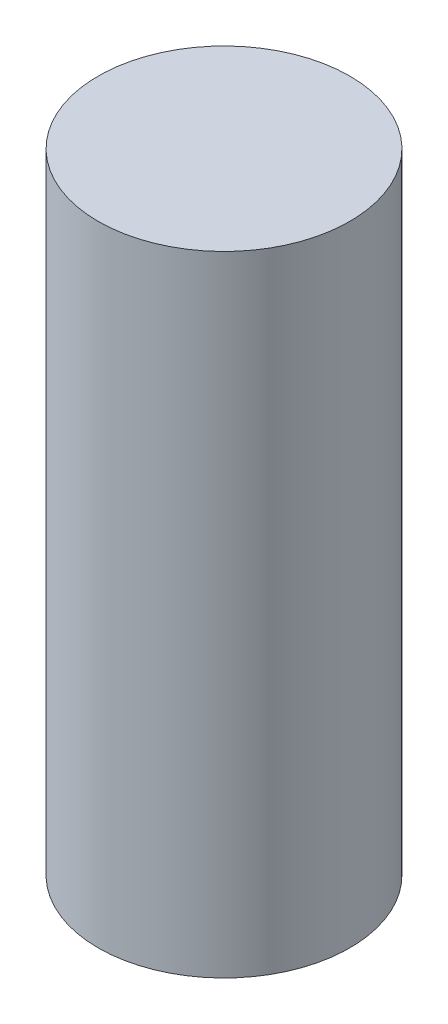
ISO-10303-21;
HEADER;
FILE_DESCRIPTION(('STEP AP214'),'2;1');
FILE_NAME('part.step','',(''),(''),'','','');
FILE_SCHEMA(('AUTOMOTIVE_DESIGN { 1 0 10303 214 1 1 1 1 }'));
ENDSEC;
DATA;
#1=APPLICATION_CONTEXT('core data for automotive mechanical design processes');
#2=APPLICATION_PROTOCOL_DEFINITION('international standard','automotive_design',2000,#1);
#3=PRODUCT_CONTEXT('',#1,'mechanical');
#4=PRODUCT('Part','Part','',(#3));
#5=PRODUCT_RELATED_PRODUCT_CATEGORY('part','',(#4));
#6=PRODUCT_DEFINITION_FORMATION('','',#4);
#7=PRODUCT_DEFINITION_CONTEXT('part definition',#1,'design');
#8=PRODUCT_DEFINITION('design','',#6,#7);
#9=PRODUCT_DEFINITION_SHAPE('','',#8);
#10=(LENGTH_UNIT() NAMED_UNIT(*) SI_UNIT(.MILLI.,.METRE.));
#11=(NAMED_UNIT(*) PLANE_ANGLE_UNIT() SI_UNIT($,.RADIAN.));
#12=(NAMED_UNIT(*) SI_UNIT($,.STERADIAN.) SOLID_ANGLE_UNIT());
#13=UNCERTAINTY_MEASURE_WITH_UNIT(LENGTH_MEASURE(1.E-05),#10,'distance_accuracy_value','');
#14=(GEOMETRIC_REPRESENTATION_CONTEXT(3) GLOBAL_UNCERTAINTY_ASSIGNED_CONTEXT((#13)) GLOBAL_UNIT_ASSIGNED_CONTEXT((#10,
#11,#12)) REPRESENTATION_CONTEXT('',''));
#15=CARTESIAN_POINT('',(0.,0.,0.));
#16=DIRECTION('',(0.,0.,1.));
#17=DIRECTION('',(1.,0.,0.));
#18=AXIS2_PLACEMENT_3D('',#15,#16,#17);
#19=CARTESIAN_POINT('',(0.,317.5,0.));
#20=DIRECTION('',(0.,-1.,0.));
#21=DIRECTION('',(0.,0.,-1.));
#22=AXIS2_PLACEMENT_3D('',#19,#20,#21);
#23=CYLINDRICAL_SURFACE('',#22,63.5);
#24=CARTESIAN_POINT('',(0.,317.5,0.));
#25=DIRECTION('',(0.,1.,0.));
#26=DIRECTION('',(0.,0.,1.));
#27=AXIS2_PLACEMENT_3D('',#24,#25,#26);
#28=CIRCLE('',#27,63.5);
#29=CARTESIAN_POINT('',(0.,317.5,-63.5));
#30=VERTEX_POINT('',#29);
#31=EDGE_CURVE('E10',#30,#30,#28,.T.);
#32=CARTESIAN_POINT('',(0.,0.,0.));
#33=DIRECTION('',(0.,1.,0.));
#34=DIRECTION('',(0.,0.,1.));
#35=AXIS2_PLACEMENT_3D('',#32,#33,#34);
#36=CIRCLE('',#35,63.5);
#37=CARTESIAN_POINT('',(0.,0.,-63.5));
#38=VERTEX_POINT('',#37);
#39=EDGE_CURVE('E37',#38,#38,#36,.T.);
#40=CARTESIAN_POINT('',(0.,317.5,-63.5));
#41=CARTESIAN_POINT('',(0.,314.192708333333,-63.5));
#42=CARTESIAN_POINT('',(0.,310.885416666667,-63.5));
#43=CARTESIAN_POINT('',(0.,304.270833333333,-63.5));
#44=CARTESIAN_POINT('',(0.,300.963541666667,-63.5));
#45=CARTESIAN_POINT('',(0.,294.348958333333,-63.5));
#46=CARTESIAN_POINT('',(0.,291.041666666667,-63.5));
#47=CARTESIAN_POINT('',(0.,284.427083333333,-63.5));
#48=CARTESIAN_POINT('',(0.,281.119791666667,-63.5));
#49=CARTESIAN_POINT('',(0.,274.505208333333,-63.5));
#50=CARTESIAN_POINT('',(0.,271.197916666667,-63.5));
#51=CARTESIAN_POINT('',(0.,264.583333333333,-63.5));
#52=CARTESIAN_POINT('',(0.,261.276041666667,-63.5));
#53=CARTESIAN_POINT('',(0.,254.661458333333,-63.5));
#54=CARTESIAN_POINT('',(0.,251.354166666667,-63.5));
#55=CARTESIAN_POINT('',(0.,244.739583333333,-63.5));
#56=CARTESIAN_POINT('',(0.,241.432291666667,-63.5));
#57=CARTESIAN_POINT('',(0.,234.817708333333,-63.5));
#58=CARTESIAN_POINT('',(0.,231.510416666667,-63.5));
#59=CARTESIAN_POINT('',(0.,224.895833333333,-63.5));
#60=CARTESIAN_POINT('',(0.,221.588541666667,-63.5));
#61=CARTESIAN_POINT('',(0.,214.973958333333,-63.5));
#62=CARTESIAN_POINT('',(0.,211.666666666667,-63.5));
#63=CARTESIAN_POINT('',(0.,205.052083333333,-63.5));
#64=CARTESIAN_POINT('',(0.,201.744791666667,-63.5));
#65=CARTESIAN_POINT('',(0.,195.130208333333,-63.5));
#66=CARTESIAN_POINT('',(0.,191.822916666667,-63.5));
#67=CARTESIAN_POINT('',(0.,185.208333333333,-63.5));
#68=CARTESIAN_POINT('',(0.,181.901041666667,-63.5));
#69=CARTESIAN_POINT('',(0.,175.286458333333,-63.5));
#70=CARTESIAN_POINT('',(0.,171.979166666667,-63.5));
#71=CARTESIAN_POINT('',(0.,165.364583333333,-63.5));
#72=CARTESIAN_POINT('',(0.,162.057291666667,-63.5));
#73=CARTESIAN_POINT('',(0.,155.442708333333,-63.5));
#74=CARTESIAN_POINT('',(0.,152.135416666667,-63.5));
#75=CARTESIAN_POINT('',(0.,145.520833333333,-63.5));
#76=CARTESIAN_POINT('',(0.,142.213541666667,-63.5));
#77=CARTESIAN_POINT('',(0.,135.598958333333,-63.5));
#78=CARTESIAN_POINT('',(0.,132.291666666667,-63.5));
#79=CARTESIAN_POINT('',(0.,125.677083333333,-63.5));
#80=CARTESIAN_POINT('',(0.,122.369791666667,-63.5));
#81=CARTESIAN_POINT('',(0.,115.755208333333,-63.5));
#82=CARTESIAN_POINT('',(0.,112.447916666667,-63.5));
#83=CARTESIAN_POINT('',(0.,105.833333333333,-63.5));
#84=CARTESIAN_POINT('',(0.,102.526041666667,-63.5));
#85=CARTESIAN_POINT('',(0.,95.9114583333333,-63.5));
#86=CARTESIAN_POINT('',(0.,92.6041666666666,-63.5));
#87=CARTESIAN_POINT('',(0.,85.9895833333333,-63.5));
#88=CARTESIAN_POINT('',(0.,82.6822916666666,-63.5));
#89=CARTESIAN_POINT('',(0.,76.0677083333333,-63.5));
#90=CARTESIAN_POINT('',(0.,72.7604166666666,-63.5));
#91=CARTESIAN_POINT('',(0.,66.1458333333333,-63.5));
#92=CARTESIAN_POINT('',(0.,62.8385416666666,-63.5));
#93=CARTESIAN_POINT('',(0.,56.2239583333333,-63.5));
#94=CARTESIAN_POINT('',(0.,52.9166666666666,-63.5));
#95=CARTESIAN_POINT('',(0.,46.3020833333333,-63.5));
#96=CARTESIAN_POINT('',(0.,42.9947916666666,-63.5));
#97=CARTESIAN_POINT('',(0.,36.3802083333333,-63.5));
#98=CARTESIAN_POINT('',(0.,33.0729166666666,-63.5));
#99=CARTESIAN_POINT('',(0.,26.4583333333333,-63.5));
#100=CARTESIAN_POINT('',(0.,23.1510416666666,-63.5));
#101=CARTESIAN_POINT('',(0.,16.5364583333333,-63.5));
#102=CARTESIAN_POINT('',(0.,13.2291666666666,-63.5));
#103=CARTESIAN_POINT('',(0.,6.61458333333329,-63.5));
#104=CARTESIAN_POINT('',(0.,3.30729166666662,-63.5));
#105=CARTESIAN_POINT('',(0.,0.,-63.5));
#106=B_SPLINE_CURVE_WITH_KNOTS('',3,(#40,#41,#42,#43,#44,#45,#46,#47,#48,#49,#50,#51,#52,#53,
#54,#55,#56,#57,#58,#59,#60,#61,#62,#63,#64,#65,#66,#67,#68,#69,#70,#71,#72,#73,#74,#75,#76,#77,
#78,#79,#80,#81,#82,#83,#84,#85,#86,#87,#88,#89,#90,#91,#92,#93,#94,#95,#96,#97,#98,#99,#100,
#101,#102,#103,#104,#105),.UNSPECIFIED.,.F.,.F.,(4,2,2,2,2,2,2,2,2,2,2,2,2,2,2,2,2,2,2,2,2,2,2,
2,2,2,2,2,2,2,2,2,4),(0.,9.92187499999997,19.84375,29.765625,39.6875,49.609375,59.53125,
69.453125,79.375,89.296875,99.21875,109.140625,119.0625,128.984375,138.90625,148.828125,158.75,
168.671875,178.59375,188.515625,198.4375,208.359375,218.28125,228.203125,238.125,248.046875,
257.96875,267.890625,277.8125,287.734375,297.65625,307.578125,317.5),.UNSPECIFIED.);
#107=EDGE_CURVE('BSEAM40',#30,#38,#106,.T.);
#108=ORIENTED_EDGE('',*,*,#31,.F.);
#109=ORIENTED_EDGE('',*,*,#39,.T.);
#110=ORIENTED_EDGE('',*,*,#107,.T.);
#111=ORIENTED_EDGE('',*,*,#107,.F.);
#112=EDGE_LOOP('',(#108,#110,#109,#111));
#113=FACE_BOUND('',#112,.T.);
#114=ADVANCED_FACE('F40',(#113),#23,.T.);
#115=CARTESIAN_POINT('',(0.,317.5,0.));
#116=DIRECTION('',(0.,1.,0.));
#117=DIRECTION('',(0.,0.,1.));
#118=AXIS2_PLACEMENT_3D('',#115,#116,#117);
#119=PLANE('',#118);
#120=ORIENTED_EDGE('',*,*,#31,.T.);
#121=EDGE_LOOP('',(#120));
#122=FACE_BOUND('',#121,.T.);
#123=ADVANCED_FACE('F55',(#122),#119,.T.);
#124=CARTESIAN_POINT('',(0.,0.,0.));
#125=DIRECTION('',(0.,1.,0.));
#126=DIRECTION('',(0.,0.,1.));
#127=AXIS2_PLACEMENT_3D('',#124,#125,#126);
#128=PLANE('',#127);
#129=ORIENTED_EDGE('',*,*,#39,.F.);
#130=EDGE_LOOP('',(#129));
#131=FACE_BOUND('',#130,.T.);
#132=ADVANCED_FACE('F49',(#131),#128,.F.);
#133=CLOSED_SHELL('',(#114,#123,#132));
#134=MANIFOLD_SOLID_BREP('B2',#133);
#135=ADVANCED_BREP_SHAPE_REPRESENTATION('',(#18,#134),#14);
#136=SHAPE_DEFINITION_REPRESENTATION(#9,#135);
ENDSEC;
END-ISO-10303-21;
